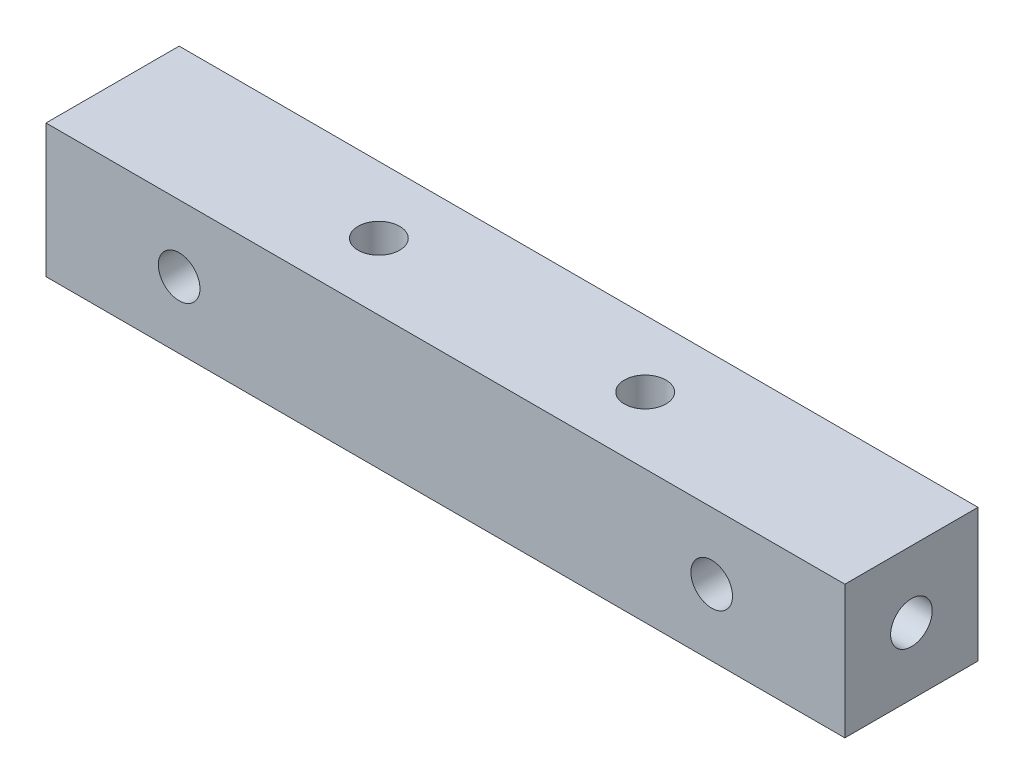
ISO-10303-21;
HEADER;
FILE_DESCRIPTION(('STEP AP214'),'2;1');
FILE_NAME('part.step','',(''),(''),'','','');
FILE_SCHEMA(('AUTOMOTIVE_DESIGN { 1 0 10303 214 1 1 1 1 }'));
ENDSEC;
DATA;
#1=APPLICATION_CONTEXT('core data for automotive mechanical design processes');
#2=APPLICATION_PROTOCOL_DEFINITION('international standard','automotive_design',2000,#1);
#3=PRODUCT_CONTEXT('',#1,'mechanical');
#4=PRODUCT('Part','Part','',(#3));
#5=PRODUCT_RELATED_PRODUCT_CATEGORY('part','',(#4));
#6=PRODUCT_DEFINITION_FORMATION('','',#4);
#7=PRODUCT_DEFINITION_CONTEXT('part definition',#1,'design');
#8=PRODUCT_DEFINITION('design','',#6,#7);
#9=PRODUCT_DEFINITION_SHAPE('','',#8);
#10=(LENGTH_UNIT() NAMED_UNIT(*) SI_UNIT(.MILLI.,.METRE.));
#11=(NAMED_UNIT(*) PLANE_ANGLE_UNIT() SI_UNIT($,.RADIAN.));
#12=(NAMED_UNIT(*) SI_UNIT($,.STERADIAN.) SOLID_ANGLE_UNIT());
#13=UNCERTAINTY_MEASURE_WITH_UNIT(LENGTH_MEASURE(1.E-05),#10,'distance_accuracy_value','');
#14=(GEOMETRIC_REPRESENTATION_CONTEXT(3) GLOBAL_UNCERTAINTY_ASSIGNED_CONTEXT((#13)) GLOBAL_UNIT_ASSIGNED_CONTEXT((#10,
#11,#12)) REPRESENTATION_CONTEXT('',''));
#15=CARTESIAN_POINT('',(0.,0.,0.));
#16=DIRECTION('',(0.,0.,1.));
#17=DIRECTION('',(1.,0.,0.));
#18=AXIS2_PLACEMENT_3D('',#15,#16,#17);
#19=CARTESIAN_POINT('',(-24.,0.,4.));
#20=DIRECTION('',(-1.,0.,0.));
#21=DIRECTION('',(0.,0.,1.));
#22=AXIS2_PLACEMENT_3D('',#19,#20,#21);
#23=CYLINDRICAL_SURFACE('',#22,1.24999999999999);
#24=CARTESIAN_POINT('',(-8.00000000000001,0.,4.));
#25=DIRECTION('',(-0.707106781186547,-0.707106781186547,0.));
#26=DIRECTION('',(-0.707106781186547,0.707106781186547,0.));
#27=AXIS2_PLACEMENT_3D('',#24,#25,#26);
#28=ELLIPSE('',#27,1.76776695296636,1.24999999999999);
#29=CARTESIAN_POINT('',(-8.00000000000001,0.,2.75000000000001));
#30=VERTEX_POINT('',#29);
#31=CARTESIAN_POINT('',(-8.00000000000001,0.,5.24999999999999));
#32=VERTEX_POINT('',#31);
#33=EDGE_CURVE('E118',#30,#32,#28,.T.);
#34=ORIENTED_EDGE('',*,*,#33,.T.);
#35=CARTESIAN_POINT('',(-8.00000000000001,0.,4.));
#36=DIRECTION('',(-0.707106781186547,0.707106781186547,0.));
#37=DIRECTION('',(-0.707106781186547,-0.707106781186547,0.));
#38=AXIS2_PLACEMENT_3D('',#35,#36,#37);
#39=ELLIPSE('',#38,1.76776695296636,1.24999999999999);
#40=EDGE_CURVE('E115',#32,#30,#39,.T.);
#41=ORIENTED_EDGE('',*,*,#40,.T.);
#42=EDGE_LOOP('',(#34,#41));
#43=FACE_BOUND('',#42,.T.);
#44=CARTESIAN_POINT('',(7.99999999999999,0.,4.));
#45=DIRECTION('',(-0.707106781186547,-0.707106781186547,0.));
#46=DIRECTION('',(-0.707106781186547,0.707106781186547,0.));
#47=AXIS2_PLACEMENT_3D('',#44,#45,#46);
#48=ELLIPSE('',#47,1.76776695296636,1.24999999999999);
#49=CARTESIAN_POINT('',(7.99999999999999,0.,2.75000000000001));
#50=VERTEX_POINT('',#49);
#51=CARTESIAN_POINT('',(7.99999999999999,0.,5.24999999999999));
#52=VERTEX_POINT('',#51);
#53=EDGE_CURVE('E49',#50,#52,#48,.F.);
#54=ORIENTED_EDGE('',*,*,#53,.T.);
#55=CARTESIAN_POINT('',(7.99999999999999,0.,4.));
#56=DIRECTION('',(-0.707106781186547,0.707106781186547,0.));
#57=DIRECTION('',(-0.707106781186547,-0.707106781186547,0.));
#58=AXIS2_PLACEMENT_3D('',#55,#56,#57);
#59=ELLIPSE('',#58,1.76776695296636,1.24999999999999);
#60=EDGE_CURVE('E11',#52,#50,#59,.F.);
#61=ORIENTED_EDGE('',*,*,#60,.T.);
#62=EDGE_LOOP('',(#54,#61));
#63=FACE_BOUND('',#62,.T.);
#64=ADVANCED_FACE('F36',(#43,#63),#23,.F.);
#65=CARTESIAN_POINT('',(-16.,0.,4.));
#66=DIRECTION('',(-0.707106781186547,0.,-0.707106781186547));
#67=DIRECTION('',(-0.707106781186547,0.,0.707106781186547));
#68=AXIS2_PLACEMENT_3D('',#65,#66,#67);
#69=ELLIPSE('',#68,1.76776695296636,1.24999999999999);
#70=CARTESIAN_POINT('',(-16.,1.24999999999999,4.));
#71=VERTEX_POINT('',#70);
#72=CARTESIAN_POINT('',(-16.,-1.25,4.));
#73=VERTEX_POINT('',#72);
#74=EDGE_CURVE('E139',#71,#73,#69,.T.);
#75=ORIENTED_EDGE('',*,*,#74,.T.);
#76=CARTESIAN_POINT('',(-16.,0.,4.));
#77=DIRECTION('',(-0.707106781186547,0.,0.707106781186547));
#78=DIRECTION('',(-0.707106781186547,0.,-0.707106781186547));
#79=AXIS2_PLACEMENT_3D('',#76,#77,#78);
#80=ELLIPSE('',#79,1.76776695296636,1.24999999999999);
#81=EDGE_CURVE('E136',#73,#71,#80,.T.);
#82=ORIENTED_EDGE('',*,*,#81,.T.);
#83=EDGE_LOOP('',(#75,#82));
#84=FACE_BOUND('',#83,.T.);
#85=CARTESIAN_POINT('',(-8.00000000000001,0.,4.));
#86=DIRECTION('',(-0.707106781186547,-0.707106781186547,0.));
#87=DIRECTION('',(-0.707106781186547,0.707106781186547,0.));
#88=AXIS2_PLACEMENT_3D('',#85,#86,#87);
#89=ELLIPSE('',#88,1.76776695296636,1.24999999999999);
#90=EDGE_CURVE('E56',#30,#32,#89,.F.);
#91=ORIENTED_EDGE('',*,*,#90,.T.);
#92=CARTESIAN_POINT('',(-8.00000000000001,0.,4.));
#93=DIRECTION('',(-0.707106781186547,0.707106781186547,0.));
#94=DIRECTION('',(-0.707106781186547,-0.707106781186547,0.));
#95=AXIS2_PLACEMENT_3D('',#92,#93,#94);
#96=ELLIPSE('',#95,1.76776695296636,1.24999999999999);
#97=EDGE_CURVE('E109',#32,#30,#96,.F.);
#98=ORIENTED_EDGE('',*,*,#97,.T.);
#99=EDGE_LOOP('',(#91,#98));
#100=FACE_BOUND('',#99,.T.);
#101=ADVANCED_FACE('F239',(#84,#100),#23,.F.);
#102=CARTESIAN_POINT('',(7.99999999999999,0.,4.));
#103=DIRECTION('',(-0.707106781186547,-0.707106781186547,0.));
#104=DIRECTION('',(-0.707106781186547,0.707106781186547,0.));
#105=AXIS2_PLACEMENT_3D('',#102,#103,#104);
#106=ELLIPSE('',#105,1.76776695296636,1.24999999999999);
#107=EDGE_CURVE('E102',#50,#52,#106,.T.);
#108=ORIENTED_EDGE('',*,*,#107,.T.);
#109=CARTESIAN_POINT('',(7.99999999999999,0.,4.));
#110=DIRECTION('',(-0.707106781186547,0.707106781186547,0.));
#111=DIRECTION('',(-0.707106781186547,-0.707106781186547,0.));
#112=AXIS2_PLACEMENT_3D('',#109,#110,#111);
#113=ELLIPSE('',#112,1.76776695296636,1.24999999999999);
#114=EDGE_CURVE('E44',#52,#50,#113,.T.);
#115=ORIENTED_EDGE('',*,*,#114,.T.);
#116=EDGE_LOOP('',(#108,#115));
#117=FACE_BOUND('',#116,.T.);
#118=CARTESIAN_POINT('',(16.,0.,4.));
#119=DIRECTION('',(-0.707106781186547,0.,-0.707106781186547));
#120=DIRECTION('',(-0.707106781186547,0.,0.707106781186547));
#121=AXIS2_PLACEMENT_3D('',#118,#119,#120);
#122=ELLIPSE('',#121,1.76776695296636,1.24999999999999);
#123=CARTESIAN_POINT('',(16.,1.24999999999999,4.));
#124=VERTEX_POINT('',#123);
#125=CARTESIAN_POINT('',(16.,-1.24999999999999,4.));
#126=VERTEX_POINT('',#125);
#127=EDGE_CURVE('E131',#124,#126,#122,.F.);
#128=ORIENTED_EDGE('',*,*,#127,.T.);
#129=CARTESIAN_POINT('',(16.,0.,4.));
#130=DIRECTION('',(-0.707106781186547,0.,0.707106781186547));
#131=DIRECTION('',(-0.707106781186547,0.,-0.707106781186547));
#132=AXIS2_PLACEMENT_3D('',#129,#130,#131);
#133=ELLIPSE('',#132,1.76776695296636,1.24999999999999);
#134=EDGE_CURVE('E122',#126,#124,#133,.F.);
#135=ORIENTED_EDGE('',*,*,#134,.T.);
#136=EDGE_LOOP('',(#128,#135));
#137=FACE_BOUND('',#136,.T.);
#138=ADVANCED_FACE('F111',(#117,#137),#23,.F.);
#139=CARTESIAN_POINT('',(-24.,0.,4.));
#140=DIRECTION('',(-1.,0.,0.));
#141=DIRECTION('',(0.,0.,1.));
#142=AXIS2_PLACEMENT_3D('',#139,#140,#141);
#143=CIRCLE('',#142,1.24999999999999);
#144=CARTESIAN_POINT('',(-24.,0.,5.24999999999999));
#145=VERTEX_POINT('',#144);
#146=EDGE_CURVE('E177',#145,#145,#143,.T.);
#147=ORIENTED_EDGE('',*,*,#146,.T.);
#148=EDGE_LOOP('',(#147));
#149=FACE_BOUND('',#148,.T.);
#150=CARTESIAN_POINT('',(-16.,0.,4.));
#151=DIRECTION('',(-0.707106781186547,0.,-0.707106781186547));
#152=DIRECTION('',(-0.707106781186547,0.,0.707106781186547));
#153=AXIS2_PLACEMENT_3D('',#150,#151,#152);
#154=ELLIPSE('',#153,1.76776695296636,1.24999999999999);
#155=EDGE_CURVE('E142',#71,#73,#154,.F.);
#156=ORIENTED_EDGE('',*,*,#155,.T.);
#157=CARTESIAN_POINT('',(-16.,0.,4.));
#158=DIRECTION('',(-0.707106781186547,0.,0.707106781186547));
#159=DIRECTION('',(-0.707106781186547,0.,-0.707106781186547));
#160=AXIS2_PLACEMENT_3D('',#157,#158,#159);
#161=ELLIPSE('',#160,1.76776695296636,1.24999999999999);
#162=EDGE_CURVE('E133',#73,#71,#161,.F.);
#163=ORIENTED_EDGE('',*,*,#162,.T.);
#164=EDGE_LOOP('',(#156,#163));
#165=FACE_BOUND('',#164,.T.);
#166=ADVANCED_FACE('F252',(#149,#165),#23,.F.);
#167=CARTESIAN_POINT('',(-24.,-4.00000000000001,8.));
#168=DIRECTION('',(1.,0.,0.));
#169=DIRECTION('',(0.,0.,-1.));
#170=AXIS2_PLACEMENT_3D('',#167,#168,#169);
#171=PLANE('',#170);
#172=ORIENTED_EDGE('',*,*,#146,.F.);
#173=EDGE_LOOP('',(#172));
#174=FACE_BOUND('',#173,.T.);
#175=DIRECTION('',(0.,-1.,0.));
#176=VECTOR('',#175,1.);
#177=CARTESIAN_POINT('',(-24.,-4.00000000000001,0.));
#178=LINE('',#177,#176);
#179=CARTESIAN_POINT('',(-24.,3.99999999999999,0.));
#180=VERTEX_POINT('',#179);
#181=CARTESIAN_POINT('',(-24.,-4.00000000000001,0.));
#182=VERTEX_POINT('',#181);
#183=EDGE_CURVE('E164',#180,#182,#178,.T.);
#184=ORIENTED_EDGE('',*,*,#183,.T.);
#185=DIRECTION('',(0.,0.,-1.));
#186=VECTOR('',#185,1.);
#187=CARTESIAN_POINT('',(-24.,-4.00000000000001,8.));
#188=LINE('',#187,#186);
#189=CARTESIAN_POINT('',(-24.,-4.00000000000001,8.));
#190=VERTEX_POINT('',#189);
#191=EDGE_CURVE('E144',#190,#182,#188,.T.);
#192=ORIENTED_EDGE('',*,*,#191,.F.);
#193=DIRECTION('',(0.,-1.,0.));
#194=VECTOR('',#193,1.);
#195=CARTESIAN_POINT('',(-24.,-4.00000000000001,8.));
#196=LINE('',#195,#194);
#197=CARTESIAN_POINT('',(-24.,3.99999999999999,8.));
#198=VERTEX_POINT('',#197);
#199=EDGE_CURVE('E159',#198,#190,#196,.T.);
#200=ORIENTED_EDGE('',*,*,#199,.F.);
#201=DIRECTION('',(0.,0.,-1.));
#202=VECTOR('',#201,1.);
#203=CARTESIAN_POINT('',(-24.,3.99999999999999,8.));
#204=LINE('',#203,#202);
#205=EDGE_CURVE('E153',#198,#180,#204,.T.);
#206=ORIENTED_EDGE('',*,*,#205,.T.);
#207=EDGE_LOOP('',(#184,#192,#200,#206));
#208=FACE_BOUND('',#207,.T.);
#209=ADVANCED_FACE('F38',(#174,#208),#171,.F.);
#210=CARTESIAN_POINT('',(24.,-4.,8.));
#211=DIRECTION('',(0.,1.,0.));
#212=DIRECTION('',(-1.,0.,0.));
#213=AXIS2_PLACEMENT_3D('',#210,#211,#212);
#214=PLANE('',#213);
#215=CARTESIAN_POINT('',(7.99999999999999,-4.00000000000001,4.));
#216=DIRECTION('',(0.,1.,0.));
#217=DIRECTION('',(0.,0.,1.));
#218=AXIS2_PLACEMENT_3D('',#215,#216,#217);
#219=CIRCLE('',#218,1.25);
#220=CARTESIAN_POINT('',(7.99999999999999,-4.00000000000001,5.25));
#221=VERTEX_POINT('',#220);
#222=EDGE_CURVE('E198',#221,#221,#219,.T.);
#223=ORIENTED_EDGE('',*,*,#222,.T.);
#224=EDGE_LOOP('',(#223));
#225=FACE_BOUND('',#224,.T.);
#226=CARTESIAN_POINT('',(-8.00000000000001,-4.00000000000001,4.));
#227=DIRECTION('',(0.,1.,0.));
#228=DIRECTION('',(0.,0.,1.));
#229=AXIS2_PLACEMENT_3D('',#226,#227,#228);
#230=CIRCLE('',#229,1.25);
#231=CARTESIAN_POINT('',(-8.00000000000001,-4.00000000000001,5.25));
#232=VERTEX_POINT('',#231);
#233=EDGE_CURVE('E192',#232,#232,#230,.T.);
#234=ORIENTED_EDGE('',*,*,#233,.T.);
#235=EDGE_LOOP('',(#234));
#236=FACE_BOUND('',#235,.T.);
#237=DIRECTION('',(1.,0.,0.));
#238=VECTOR('',#237,1.);
#239=CARTESIAN_POINT('',(24.,-4.,0.));
#240=LINE('',#239,#238);
#241=CARTESIAN_POINT('',(24.,-4.,0.));
#242=VERTEX_POINT('',#241);
#243=EDGE_CURVE('E162',#182,#242,#240,.T.);
#244=ORIENTED_EDGE('',*,*,#243,.T.);
#245=DIRECTION('',(0.,0.,-1.));
#246=VECTOR('',#245,1.);
#247=CARTESIAN_POINT('',(24.,-4.,8.));
#248=LINE('',#247,#246);
#249=CARTESIAN_POINT('',(24.,-4.,8.));
#250=VERTEX_POINT('',#249);
#251=EDGE_CURVE('E147',#250,#242,#248,.T.);
#252=ORIENTED_EDGE('',*,*,#251,.F.);
#253=DIRECTION('',(1.,0.,0.));
#254=VECTOR('',#253,1.);
#255=CARTESIAN_POINT('',(24.,-4.,8.));
#256=LINE('',#255,#254);
#257=EDGE_CURVE('E171',#190,#250,#256,.T.);
#258=ORIENTED_EDGE('',*,*,#257,.F.);
#259=ORIENTED_EDGE('',*,*,#191,.T.);
#260=EDGE_LOOP('',(#244,#252,#258,#259));
#261=FACE_BOUND('',#260,.T.);
#262=ADVANCED_FACE('F227',(#225,#236,#261),#214,.F.);
#263=CARTESIAN_POINT('',(24.,-4.,8.));
#264=DIRECTION('',(-1.,0.,0.));
#265=DIRECTION('',(0.,0.,1.));
#266=AXIS2_PLACEMENT_3D('',#263,#264,#265);
#267=PLANE('',#266);
#268=CARTESIAN_POINT('',(24.,0.,4.));
#269=DIRECTION('',(-1.,0.,0.));
#270=DIRECTION('',(0.,0.,1.));
#271=AXIS2_PLACEMENT_3D('',#268,#269,#270);
#272=CIRCLE('',#271,1.24999999999999);
#273=CARTESIAN_POINT('',(24.,0.,5.25));
#274=VERTEX_POINT('',#273);
#275=EDGE_CURVE('E167',#274,#274,#272,.T.);
#276=ORIENTED_EDGE('',*,*,#275,.T.);
#277=EDGE_LOOP('',(#276));
#278=FACE_BOUND('',#277,.T.);
#279=DIRECTION('',(0.,1.,0.));
#280=VECTOR('',#279,1.);
#281=CARTESIAN_POINT('',(24.,-4.,0.));
#282=LINE('',#281,#280);
#283=CARTESIAN_POINT('',(24.,4.,0.));
#284=VERTEX_POINT('',#283);
#285=EDGE_CURVE('E160',#242,#284,#282,.T.);
#286=ORIENTED_EDGE('',*,*,#285,.T.);
#287=DIRECTION('',(0.,0.,-1.));
#288=VECTOR('',#287,1.);
#289=CARTESIAN_POINT('',(24.,4.,8.));
#290=LINE('',#289,#288);
#291=CARTESIAN_POINT('',(24.,4.,8.));
#292=VERTEX_POINT('',#291);
#293=EDGE_CURVE('E150',#292,#284,#290,.T.);
#294=ORIENTED_EDGE('',*,*,#293,.F.);
#295=DIRECTION('',(0.,1.,0.));
#296=VECTOR('',#295,1.);
#297=CARTESIAN_POINT('',(24.,-4.,8.));
#298=LINE('',#297,#296);
#299=EDGE_CURVE('E169',#250,#292,#298,.T.);
#300=ORIENTED_EDGE('',*,*,#299,.F.);
#301=ORIENTED_EDGE('',*,*,#251,.T.);
#302=EDGE_LOOP('',(#286,#294,#300,#301));
#303=FACE_BOUND('',#302,.T.);
#304=ADVANCED_FACE('F210',(#278,#303),#267,.F.);
#305=CARTESIAN_POINT('',(24.,4.,8.));
#306=DIRECTION('',(0.,-1.,0.));
#307=DIRECTION('',(1.,0.,0.));
#308=AXIS2_PLACEMENT_3D('',#305,#306,#307);
#309=PLANE('',#308);
#310=CARTESIAN_POINT('',(7.99999999999999,4.,4.));
#311=DIRECTION('',(0.,1.,0.));
#312=DIRECTION('',(0.,0.,1.));
#313=AXIS2_PLACEMENT_3D('',#310,#311,#312);
#314=CIRCLE('',#313,1.24999999999999);
#315=CARTESIAN_POINT('',(7.99999999999999,4.,5.24999999999999));
#316=VERTEX_POINT('',#315);
#317=EDGE_CURVE('E201',#316,#316,#314,.T.);
#318=ORIENTED_EDGE('',*,*,#317,.F.);
#319=EDGE_LOOP('',(#318));
#320=FACE_BOUND('',#319,.T.);
#321=CARTESIAN_POINT('',(-8.00000000000001,4.,4.));
#322=DIRECTION('',(0.,1.,0.));
#323=DIRECTION('',(0.,0.,1.));
#324=AXIS2_PLACEMENT_3D('',#321,#322,#323);
#325=CIRCLE('',#324,1.24999999999999);
#326=CARTESIAN_POINT('',(-8.00000000000001,4.,5.24999999999999));
#327=VERTEX_POINT('',#326);
#328=EDGE_CURVE('E195',#327,#327,#325,.T.);
#329=ORIENTED_EDGE('',*,*,#328,.F.);
#330=EDGE_LOOP('',(#329));
#331=FACE_BOUND('',#330,.T.);
#332=DIRECTION('',(-1.,0.,0.));
#333=VECTOR('',#332,1.);
#334=CARTESIAN_POINT('',(24.,4.,0.));
#335=LINE('',#334,#333);
#336=EDGE_CURVE('E157',#284,#180,#335,.T.);
#337=ORIENTED_EDGE('',*,*,#336,.T.);
#338=ORIENTED_EDGE('',*,*,#205,.F.);
#339=DIRECTION('',(-1.,0.,0.));
#340=VECTOR('',#339,1.);
#341=CARTESIAN_POINT('',(24.,4.,8.));
#342=LINE('',#341,#340);
#343=EDGE_CURVE('E156',#292,#198,#342,.T.);
#344=ORIENTED_EDGE('',*,*,#343,.F.);
#345=ORIENTED_EDGE('',*,*,#293,.T.);
#346=EDGE_LOOP('',(#337,#338,#344,#345));
#347=FACE_BOUND('',#346,.T.);
#348=ADVANCED_FACE('F206',(#320,#331,#347),#309,.F.);
#349=CARTESIAN_POINT('',(0.,0.,8.));
#350=DIRECTION('',(0.,0.,1.));
#351=DIRECTION('',(1.,0.,0.));
#352=AXIS2_PLACEMENT_3D('',#349,#350,#351);
#353=PLANE('',#352);
#354=CARTESIAN_POINT('',(16.,0.,8.));
#355=DIRECTION('',(0.,0.,1.));
#356=DIRECTION('',(1.,0.,0.));
#357=AXIS2_PLACEMENT_3D('',#354,#355,#356);
#358=CIRCLE('',#357,1.24999999999999);
#359=CARTESIAN_POINT('',(17.25,0.,8.));
#360=VERTEX_POINT('',#359);
#361=EDGE_CURVE('E189',#360,#360,#358,.T.);
#362=ORIENTED_EDGE('',*,*,#361,.F.);
#363=EDGE_LOOP('',(#362));
#364=FACE_BOUND('',#363,.T.);
#365=CARTESIAN_POINT('',(-16.,0.,8.));
#366=DIRECTION('',(0.,0.,1.));
#367=DIRECTION('',(1.,0.,0.));
#368=AXIS2_PLACEMENT_3D('',#365,#366,#367);
#369=CIRCLE('',#368,1.24999999999999);
#370=CARTESIAN_POINT('',(-14.75,0.,8.));
#371=VERTEX_POINT('',#370);
#372=EDGE_CURVE('E183',#371,#371,#369,.T.);
#373=ORIENTED_EDGE('',*,*,#372,.F.);
#374=EDGE_LOOP('',(#373));
#375=FACE_BOUND('',#374,.T.);
#376=ORIENTED_EDGE('',*,*,#199,.T.);
#377=ORIENTED_EDGE('',*,*,#257,.T.);
#378=ORIENTED_EDGE('',*,*,#299,.T.);
#379=ORIENTED_EDGE('',*,*,#343,.T.);
#380=EDGE_LOOP('',(#376,#377,#378,#379));
#381=FACE_BOUND('',#380,.T.);
#382=ADVANCED_FACE('F209',(#364,#375,#381),#353,.T.);
#383=CARTESIAN_POINT('',(0.,0.,0.));
#384=DIRECTION('',(0.,0.,1.));
#385=DIRECTION('',(1.,0.,0.));
#386=AXIS2_PLACEMENT_3D('',#383,#384,#385);
#387=PLANE('',#386);
#388=CARTESIAN_POINT('',(16.,0.,0.));
#389=DIRECTION('',(0.,0.,1.));
#390=DIRECTION('',(1.,0.,0.));
#391=AXIS2_PLACEMENT_3D('',#388,#389,#390);
#392=CIRCLE('',#391,1.25);
#393=CARTESIAN_POINT('',(17.25,0.,0.));
#394=VERTEX_POINT('',#393);
#395=EDGE_CURVE('E186',#394,#394,#392,.T.);
#396=ORIENTED_EDGE('',*,*,#395,.T.);
#397=EDGE_LOOP('',(#396));
#398=FACE_BOUND('',#397,.T.);
#399=CARTESIAN_POINT('',(-16.,0.,0.));
#400=DIRECTION('',(0.,0.,1.));
#401=DIRECTION('',(1.,0.,0.));
#402=AXIS2_PLACEMENT_3D('',#399,#400,#401);
#403=CIRCLE('',#402,1.25);
#404=CARTESIAN_POINT('',(-14.75,0.,0.));
#405=VERTEX_POINT('',#404);
#406=EDGE_CURVE('E180',#405,#405,#403,.T.);
#407=ORIENTED_EDGE('',*,*,#406,.T.);
#408=EDGE_LOOP('',(#407));
#409=FACE_BOUND('',#408,.T.);
#410=ORIENTED_EDGE('',*,*,#183,.F.);
#411=ORIENTED_EDGE('',*,*,#336,.F.);
#412=ORIENTED_EDGE('',*,*,#285,.F.);
#413=ORIENTED_EDGE('',*,*,#243,.F.);
#414=EDGE_LOOP('',(#410,#411,#412,#413));
#415=FACE_BOUND('',#414,.T.);
#416=ADVANCED_FACE('F224',(#398,#409,#415),#387,.F.);
#417=CARTESIAN_POINT('',(16.,0.,4.));
#418=DIRECTION('',(-0.707106781186547,0.,-0.707106781186547));
#419=DIRECTION('',(-0.707106781186547,0.,0.707106781186547));
#420=AXIS2_PLACEMENT_3D('',#417,#418,#419);
#421=ELLIPSE('',#420,1.76776695296636,1.24999999999999);
#422=EDGE_CURVE('E128',#124,#126,#421,.T.);
#423=ORIENTED_EDGE('',*,*,#422,.T.);
#424=CARTESIAN_POINT('',(16.,0.,4.));
#425=DIRECTION('',(-0.707106781186547,0.,0.707106781186547));
#426=DIRECTION('',(-0.707106781186547,0.,-0.707106781186547));
#427=AXIS2_PLACEMENT_3D('',#424,#425,#426);
#428=ELLIPSE('',#427,1.76776695296636,1.24999999999999);
#429=EDGE_CURVE('E125',#126,#124,#428,.T.);
#430=ORIENTED_EDGE('',*,*,#429,.T.);
#431=EDGE_LOOP('',(#423,#430));
#432=FACE_BOUND('',#431,.T.);
#433=ORIENTED_EDGE('',*,*,#275,.F.);
#434=EDGE_LOOP('',(#433));
#435=FACE_BOUND('',#434,.T.);
#436=ADVANCED_FACE('F242',(#432,#435),#23,.F.);
#437=CARTESIAN_POINT('',(-16.,0.,8.));
#438=DIRECTION('',(0.,0.,1.));
#439=DIRECTION('',(1.,0.,0.));
#440=AXIS2_PLACEMENT_3D('',#437,#438,#439);
#441=CYLINDRICAL_SURFACE('',#440,1.24999999999999);
#442=ORIENTED_EDGE('',*,*,#372,.T.);
#443=EDGE_LOOP('',(#442));
#444=FACE_BOUND('',#443,.T.);
#445=ORIENTED_EDGE('',*,*,#155,.F.);
#446=ORIENTED_EDGE('',*,*,#81,.F.);
#447=EDGE_LOOP('',(#445,#446));
#448=FACE_BOUND('',#447,.T.);
#449=ADVANCED_FACE('F250',(#444,#448),#441,.F.);
#450=ORIENTED_EDGE('',*,*,#406,.F.);
#451=EDGE_LOOP('',(#450));
#452=FACE_BOUND('',#451,.T.);
#453=ORIENTED_EDGE('',*,*,#74,.F.);
#454=ORIENTED_EDGE('',*,*,#162,.F.);
#455=EDGE_LOOP('',(#453,#454));
#456=FACE_BOUND('',#455,.T.);
#457=ADVANCED_FACE('F257',(#452,#456),#441,.F.);
#458=CARTESIAN_POINT('',(16.,0.,8.));
#459=DIRECTION('',(0.,0.,1.));
#460=DIRECTION('',(1.,0.,0.));
#461=AXIS2_PLACEMENT_3D('',#458,#459,#460);
#462=CYLINDRICAL_SURFACE('',#461,1.24999999999999);
#463=ORIENTED_EDGE('',*,*,#361,.T.);
#464=EDGE_LOOP('',(#463));
#465=FACE_BOUND('',#464,.T.);
#466=ORIENTED_EDGE('',*,*,#127,.F.);
#467=ORIENTED_EDGE('',*,*,#429,.F.);
#468=EDGE_LOOP('',(#466,#467));
#469=FACE_BOUND('',#468,.T.);
#470=ADVANCED_FACE('F277',(#465,#469),#462,.F.);
#471=ORIENTED_EDGE('',*,*,#395,.F.);
#472=EDGE_LOOP('',(#471));
#473=FACE_BOUND('',#472,.T.);
#474=ORIENTED_EDGE('',*,*,#422,.F.);
#475=ORIENTED_EDGE('',*,*,#134,.F.);
#476=EDGE_LOOP('',(#474,#475));
#477=FACE_BOUND('',#476,.T.);
#478=ADVANCED_FACE('F282',(#473,#477),#462,.F.);
#479=CARTESIAN_POINT('',(-8.00000000000001,4.,4.));
#480=DIRECTION('',(0.,1.,0.));
#481=DIRECTION('',(0.,0.,1.));
#482=AXIS2_PLACEMENT_3D('',#479,#480,#481);
#483=CYLINDRICAL_SURFACE('',#482,1.24999999999999);
#484=ORIENTED_EDGE('',*,*,#328,.T.);
#485=EDGE_LOOP('',(#484));
#486=FACE_BOUND('',#485,.T.);
#487=ORIENTED_EDGE('',*,*,#90,.F.);
#488=ORIENTED_EDGE('',*,*,#40,.F.);
#489=EDGE_LOOP('',(#487,#488));
#490=FACE_BOUND('',#489,.T.);
#491=ADVANCED_FACE('F288',(#486,#490),#483,.F.);
#492=ORIENTED_EDGE('',*,*,#233,.F.);
#493=EDGE_LOOP('',(#492));
#494=FACE_BOUND('',#493,.T.);
#495=ORIENTED_EDGE('',*,*,#33,.F.);
#496=ORIENTED_EDGE('',*,*,#97,.F.);
#497=EDGE_LOOP('',(#495,#496));
#498=FACE_BOUND('',#497,.T.);
#499=ADVANCED_FACE('F290',(#494,#498),#483,.F.);
#500=CARTESIAN_POINT('',(7.99999999999999,4.,4.));
#501=DIRECTION('',(0.,1.,0.));
#502=DIRECTION('',(0.,0.,1.));
#503=AXIS2_PLACEMENT_3D('',#500,#501,#502);
#504=CYLINDRICAL_SURFACE('',#503,1.24999999999999);
#505=ORIENTED_EDGE('',*,*,#317,.T.);
#506=EDGE_LOOP('',(#505));
#507=FACE_BOUND('',#506,.T.);
#508=ORIENTED_EDGE('',*,*,#53,.F.);
#509=ORIENTED_EDGE('',*,*,#114,.F.);
#510=EDGE_LOOP('',(#508,#509));
#511=FACE_BOUND('',#510,.T.);
#512=ADVANCED_FACE('F108',(#507,#511),#504,.F.);
#513=ORIENTED_EDGE('',*,*,#222,.F.);
#514=EDGE_LOOP('',(#513));
#515=FACE_BOUND('',#514,.T.);
#516=ORIENTED_EDGE('',*,*,#107,.F.);
#517=ORIENTED_EDGE('',*,*,#60,.F.);
#518=EDGE_LOOP('',(#516,#517));
#519=FACE_BOUND('',#518,.T.);
#520=ADVANCED_FACE('F103',(#515,#519),#504,.F.);
#521=CLOSED_SHELL('',(#64,#101,#138,#166,#209,#262,#304,#348,#382,#416,#436,#449,#457,#470,#478,
#491,#499,#512,#520));
#522=MANIFOLD_SOLID_BREP('B2',#521);
#523=ADVANCED_BREP_SHAPE_REPRESENTATION('',(#18,#522),#14);
#524=SHAPE_DEFINITION_REPRESENTATION(#9,#523);
ENDSEC;
END-ISO-10303-21;
